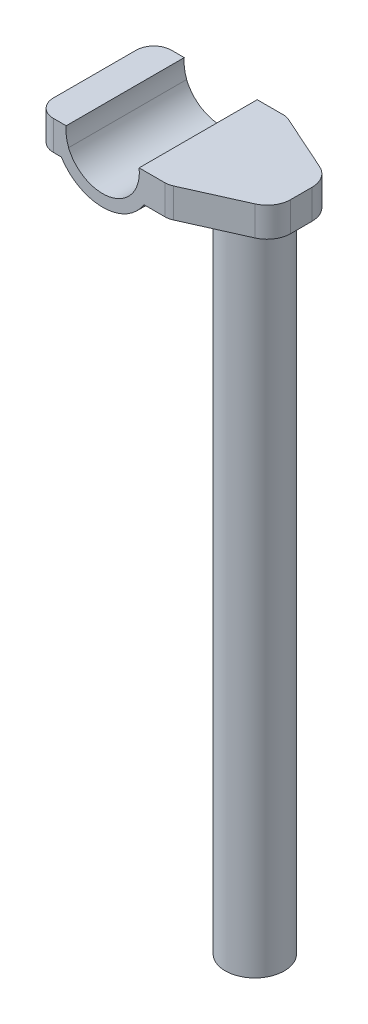
ISO-10303-21;
HEADER;
FILE_DESCRIPTION(('STEP AP214'),'2;1');
FILE_NAME('part.step','',(''),(''),'','','');
FILE_SCHEMA(('AUTOMOTIVE_DESIGN { 1 0 10303 214 1 1 1 1 }'));
ENDSEC;
DATA;
#1=APPLICATION_CONTEXT('core data for automotive mechanical design processes');
#2=APPLICATION_PROTOCOL_DEFINITION('international standard','automotive_design',2000,#1);
#3=PRODUCT_CONTEXT('',#1,'mechanical');
#4=PRODUCT('Part','Part','',(#3));
#5=PRODUCT_RELATED_PRODUCT_CATEGORY('part','',(#4));
#6=PRODUCT_DEFINITION_FORMATION('','',#4);
#7=PRODUCT_DEFINITION_CONTEXT('part definition',#1,'design');
#8=PRODUCT_DEFINITION('design','',#6,#7);
#9=PRODUCT_DEFINITION_SHAPE('','',#8);
#10=(LENGTH_UNIT() NAMED_UNIT(*) SI_UNIT(.MILLI.,.METRE.));
#11=(NAMED_UNIT(*) PLANE_ANGLE_UNIT() SI_UNIT($,.RADIAN.));
#12=(NAMED_UNIT(*) SI_UNIT($,.STERADIAN.) SOLID_ANGLE_UNIT());
#13=UNCERTAINTY_MEASURE_WITH_UNIT(LENGTH_MEASURE(1.E-05),#10,'distance_accuracy_value','');
#14=(GEOMETRIC_REPRESENTATION_CONTEXT(3) GLOBAL_UNCERTAINTY_ASSIGNED_CONTEXT((#13)) GLOBAL_UNIT_ASSIGNED_CONTEXT((#10,
#11,#12)) REPRESENTATION_CONTEXT('',''));
#15=CARTESIAN_POINT('',(0.,0.,0.));
#16=DIRECTION('',(0.,0.,1.));
#17=DIRECTION('',(1.,0.,0.));
#18=AXIS2_PLACEMENT_3D('',#15,#16,#17);
#19=CARTESIAN_POINT('',(-29.,26.,-14.));
#20=DIRECTION('',(0.,1.,0.));
#21=DIRECTION('',(0.,0.,1.));
#22=AXIS2_PLACEMENT_3D('',#19,#20,#21);
#23=PLANE('',#22);
#24=DIRECTION('',(0.,0.,1.));
#25=VECTOR('',#24,1.);
#26=CARTESIAN_POINT('',(-24.6799216430452,26.,-20.));
#27=LINE('',#26,#25);
#28=CARTESIAN_POINT('',(-24.6799216430452,26.,-20.));
#29=VERTEX_POINT('',#28);
#30=CARTESIAN_POINT('',(-24.6799216430452,26.,20.));
#31=VERTEX_POINT('',#30);
#32=EDGE_CURVE('E189',#29,#31,#27,.T.);
#33=ORIENTED_EDGE('',*,*,#32,.F.);
#34=DIRECTION('',(-1.,0.,0.));
#35=VECTOR('',#34,1.);
#36=CARTESIAN_POINT('',(8.71741430630259,26.,-20.));
#37=LINE('',#36,#35);
#38=CARTESIAN_POINT('',(-29.,26.,-20.));
#39=VERTEX_POINT('',#38);
#40=EDGE_CURVE('E225',#29,#39,#37,.T.);
#41=ORIENTED_EDGE('',*,*,#40,.T.);
#42=CARTESIAN_POINT('',(-29.,26.,-14.));
#43=DIRECTION('',(0.,1.,0.));
#44=DIRECTION('',(0.,0.,1.));
#45=AXIS2_PLACEMENT_3D('',#42,#43,#44);
#46=CIRCLE('',#45,6.);
#47=CARTESIAN_POINT('',(-35.,26.,-14.));
#48=VERTEX_POINT('',#47);
#49=EDGE_CURVE('E236',#39,#48,#46,.T.);
#50=ORIENTED_EDGE('',*,*,#49,.T.);
#51=DIRECTION('',(0.,0.,1.));
#52=VECTOR('',#51,1.);
#53=CARTESIAN_POINT('',(-35.,26.,-14.));
#54=LINE('',#53,#52);
#55=CARTESIAN_POINT('',(-35.,26.,14.));
#56=VERTEX_POINT('',#55);
#57=EDGE_CURVE('E203',#48,#56,#54,.T.);
#58=ORIENTED_EDGE('',*,*,#57,.T.);
#59=CARTESIAN_POINT('',(-29.,26.,14.));
#60=DIRECTION('',(0.,1.,0.));
#61=DIRECTION('',(0.,0.,1.));
#62=AXIS2_PLACEMENT_3D('',#59,#60,#61);
#63=CIRCLE('',#62,6.);
#64=CARTESIAN_POINT('',(-29.,26.,20.));
#65=VERTEX_POINT('',#64);
#66=EDGE_CURVE('E198',#56,#65,#63,.T.);
#67=ORIENTED_EDGE('',*,*,#66,.T.);
#68=DIRECTION('',(1.,0.,0.));
#69=VECTOR('',#68,1.);
#70=CARTESIAN_POINT('',(-29.,26.,20.));
#71=LINE('',#70,#69);
#72=EDGE_CURVE('E197',#65,#31,#71,.T.);
#73=ORIENTED_EDGE('',*,*,#72,.T.);
#74=EDGE_LOOP('',(#33,#41,#50,#58,#67,#73));
#75=FACE_BOUND('',#74,.T.);
#76=ADVANCED_FACE('F38',(#75),#23,.T.);
#77=CARTESIAN_POINT('',(-29.,20.,-14.));
#78=DIRECTION('',(0.,1.,0.));
#79=DIRECTION('',(0.,0.,1.));
#80=AXIS2_PLACEMENT_3D('',#77,#78,#79);
#81=PLANE('',#80);
#82=DIRECTION('',(-1.,0.,0.));
#83=VECTOR('',#82,1.);
#84=CARTESIAN_POINT('',(8.71741430630259,20.,-20.));
#85=LINE('',#84,#83);
#86=CARTESIAN_POINT('',(-23.8375267674244,20.,-20.));
#87=VERTEX_POINT('',#86);
#88=CARTESIAN_POINT('',(-23.9,20.,-20.));
#89=VERTEX_POINT('',#88);
#90=EDGE_CURVE('E231',#87,#89,#85,.T.);
#91=ORIENTED_EDGE('',*,*,#90,.F.);
#92=DIRECTION('',(0.,0.,1.));
#93=VECTOR('',#92,1.);
#94=CARTESIAN_POINT('',(-23.8375267674244,20.,-20.));
#95=LINE('',#94,#93);
#96=CARTESIAN_POINT('',(-23.8375267674244,20.,20.));
#97=VERTEX_POINT('',#96);
#98=EDGE_CURVE('E12',#87,#97,#95,.T.);
#99=ORIENTED_EDGE('',*,*,#98,.T.);
#100=DIRECTION('',(1.,0.,0.));
#101=VECTOR('',#100,1.);
#102=CARTESIAN_POINT('',(-29.,20.,20.));
#103=LINE('',#102,#101);
#104=CARTESIAN_POINT('',(-23.9,20.,20.));
#105=VERTEX_POINT('',#104);
#106=EDGE_CURVE('E228',#105,#97,#103,.T.);
#107=ORIENTED_EDGE('',*,*,#106,.F.);
#108=DIRECTION('',(0.,0.,1.));
#109=VECTOR('',#108,1.);
#110=CARTESIAN_POINT('',(-23.9,20.,-20.));
#111=LINE('',#110,#109);
#112=EDGE_CURVE('E256',#89,#105,#111,.T.);
#113=ORIENTED_EDGE('',*,*,#112,.F.);
#114=EDGE_LOOP('',(#91,#99,#107,#113));
#115=FACE_BOUND('',#114,.T.);
#116=ADVANCED_FACE('F339',(#115),#81,.F.);
#117=CARTESIAN_POINT('',(-29.,20.,-14.));
#118=DIRECTION('',(0.,-1.,0.));
#119=DIRECTION('',(0.,0.,-1.));
#120=AXIS2_PLACEMENT_3D('',#117,#118,#119);
#121=CYLINDRICAL_SURFACE('',#120,6.);
#122=CARTESIAN_POINT('',(-29.,16.,-14.));
#123=DIRECTION('',(0.,-1.,0.));
#124=DIRECTION('',(0.,0.,-1.));
#125=AXIS2_PLACEMENT_3D('',#122,#123,#124);
#126=CIRCLE('',#125,6.);
#127=CARTESIAN_POINT('',(-35.,16.,-14.));
#128=VERTEX_POINT('',#127);
#129=CARTESIAN_POINT('',(-29.,16.,-20.));
#130=VERTEX_POINT('',#129);
#131=EDGE_CURVE('E272',#128,#130,#126,.T.);
#132=ORIENTED_EDGE('',*,*,#131,.F.);
#133=DIRECTION('',(0.,-1.,0.));
#134=VECTOR('',#133,1.);
#135=CARTESIAN_POINT('',(-35.,20.,-14.));
#136=LINE('',#135,#134);
#137=EDGE_CURVE('E317',#48,#128,#136,.T.);
#138=ORIENTED_EDGE('',*,*,#137,.F.);
#139=ORIENTED_EDGE('',*,*,#49,.F.);
#140=DIRECTION('',(0.,-1.,0.));
#141=VECTOR('',#140,1.);
#142=CARTESIAN_POINT('',(-29.,20.,-20.));
#143=LINE('',#142,#141);
#144=EDGE_CURVE('E286',#39,#130,#143,.T.);
#145=ORIENTED_EDGE('',*,*,#144,.T.);
#146=EDGE_LOOP('',(#132,#138,#139,#145));
#147=FACE_BOUND('',#146,.T.);
#148=ADVANCED_FACE('F40',(#147),#121,.T.);
#149=CARTESIAN_POINT('',(-35.,20.,14.));
#150=DIRECTION('',(1.,0.,0.));
#151=DIRECTION('',(0.,0.,-1.));
#152=AXIS2_PLACEMENT_3D('',#149,#150,#151);
#153=PLANE('',#152);
#154=DIRECTION('',(0.,0.,1.));
#155=VECTOR('',#154,1.);
#156=CARTESIAN_POINT('',(-35.,16.,-20.));
#157=LINE('',#156,#155);
#158=CARTESIAN_POINT('',(-35.,16.,14.));
#159=VERTEX_POINT('',#158);
#160=EDGE_CURVE('E247',#128,#159,#157,.T.);
#161=ORIENTED_EDGE('',*,*,#160,.T.);
#162=DIRECTION('',(0.,-1.,0.));
#163=VECTOR('',#162,1.);
#164=CARTESIAN_POINT('',(-35.,20.,14.));
#165=LINE('',#164,#163);
#166=EDGE_CURVE('E314',#56,#159,#165,.T.);
#167=ORIENTED_EDGE('',*,*,#166,.F.);
#168=ORIENTED_EDGE('',*,*,#57,.F.);
#169=ORIENTED_EDGE('',*,*,#137,.T.);
#170=EDGE_LOOP('',(#161,#167,#168,#169));
#171=FACE_BOUND('',#170,.T.);
#172=ADVANCED_FACE('F363',(#171),#153,.F.);
#173=CARTESIAN_POINT('',(-29.,20.,14.));
#174=DIRECTION('',(0.,-1.,0.));
#175=DIRECTION('',(0.,0.,-1.));
#176=AXIS2_PLACEMENT_3D('',#173,#174,#175);
#177=CYLINDRICAL_SURFACE('',#176,6.);
#178=CARTESIAN_POINT('',(-29.,16.,14.));
#179=DIRECTION('',(0.,-1.,0.));
#180=DIRECTION('',(0.,0.,-1.));
#181=AXIS2_PLACEMENT_3D('',#178,#179,#180);
#182=CIRCLE('',#181,6.);
#183=CARTESIAN_POINT('',(-29.,16.,20.));
#184=VERTEX_POINT('',#183);
#185=EDGE_CURVE('E259',#184,#159,#182,.T.);
#186=ORIENTED_EDGE('',*,*,#185,.F.);
#187=DIRECTION('',(0.,-1.,0.));
#188=VECTOR('',#187,1.);
#189=CARTESIAN_POINT('',(-29.,20.,20.));
#190=LINE('',#189,#188);
#191=EDGE_CURVE('E311',#65,#184,#190,.T.);
#192=ORIENTED_EDGE('',*,*,#191,.F.);
#193=ORIENTED_EDGE('',*,*,#66,.F.);
#194=ORIENTED_EDGE('',*,*,#166,.T.);
#195=EDGE_LOOP('',(#186,#192,#193,#194));
#196=FACE_BOUND('',#195,.T.);
#197=ADVANCED_FACE('F358',(#196),#177,.T.);
#198=CARTESIAN_POINT('',(-29.,20.,20.));
#199=DIRECTION('',(0.,0.,-1.));
#200=DIRECTION('',(-1.,0.,0.));
#201=AXIS2_PLACEMENT_3D('',#198,#199,#200);
#202=PLANE('',#201);
#203=CARTESIAN_POINT('',(0.0273188640108665,26.,20.));
#204=VERTEX_POINT('',#203);
#205=CARTESIAN_POINT('',(8.71741430630259,26.,20.));
#206=VERTEX_POINT('',#205);
#207=EDGE_CURVE('E184',#204,#206,#71,.T.);
#208=ORIENTED_EDGE('',*,*,#207,.F.);
#209=CARTESIAN_POINT('',(-12.3263013895172,24.6753019722837,20.));
#210=DIRECTION('',(0.,0.,1.));
#211=DIRECTION('',(1.,0.,0.));
#212=AXIS2_PLACEMENT_3D('',#209,#210,#211);
#213=CIRCLE('',#212,12.4244419686767);
#214=CARTESIAN_POINT('',(-0.815076011610006,20.,20.));
#215=VERTEX_POINT('',#214);
#216=EDGE_CURVE('E172',#215,#204,#213,.T.);
#217=ORIENTED_EDGE('',*,*,#216,.F.);
#218=CARTESIAN_POINT('',(-0.775337840305649,20.,20.));
#219=VERTEX_POINT('',#218);
#220=EDGE_CURVE('E232',#215,#219,#103,.T.);
#221=ORIENTED_EDGE('',*,*,#220,.T.);
#222=CARTESIAN_POINT('',(-12.3376689201528,24.75,20.));
#223=DIRECTION('',(0.,0.,-1.));
#224=DIRECTION('',(1.,0.,0.));
#225=AXIS2_PLACEMENT_3D('',#222,#223,#224);
#226=CIRCLE('',#225,12.5);
#227=EDGE_CURVE('E240',#219,#105,#226,.T.);
#228=ORIENTED_EDGE('',*,*,#227,.T.);
#229=ORIENTED_EDGE('',*,*,#106,.T.);
#230=EDGE_CURVE('E53',#31,#97,#213,.T.);
#231=ORIENTED_EDGE('',*,*,#230,.F.);
#232=ORIENTED_EDGE('',*,*,#72,.F.);
#233=ORIENTED_EDGE('',*,*,#191,.T.);
#234=DIRECTION('',(1.,0.,0.));
#235=VECTOR('',#234,1.);
#236=CARTESIAN_POINT('',(-35.,16.,20.));
#237=LINE('',#236,#235);
#238=CARTESIAN_POINT('',(-26.3265037536906,16.,20.));
#239=VERTEX_POINT('',#238);
#240=EDGE_CURVE('E227',#184,#239,#237,.T.);
#241=ORIENTED_EDGE('',*,*,#240,.T.);
#242=CARTESIAN_POINT('',(-12.3376689201528,24.75,20.));
#243=DIRECTION('',(0.,0.,1.));
#244=DIRECTION('',(1.,0.,0.));
#245=AXIS2_PLACEMENT_3D('',#242,#243,#244);
#246=CIRCLE('',#245,16.5);
#247=CARTESIAN_POINT('',(1.65116591338496,16.,20.));
#248=VERTEX_POINT('',#247);
#249=EDGE_CURVE('E250',#239,#248,#246,.T.);
#250=ORIENTED_EDGE('',*,*,#249,.T.);
#251=DIRECTION('',(1.,0.,0.));
#252=VECTOR('',#251,1.);
#253=CARTESIAN_POINT('',(1.65116591338496,16.,20.));
#254=LINE('',#253,#252);
#255=CARTESIAN_POINT('',(8.71741430630261,16.,20.));
#256=VERTEX_POINT('',#255);
#257=EDGE_CURVE('E253',#248,#256,#254,.T.);
#258=ORIENTED_EDGE('',*,*,#257,.T.);
#259=DIRECTION('',(0.,-1.,0.));
#260=VECTOR('',#259,1.);
#261=CARTESIAN_POINT('',(8.71741430630259,20.,20.));
#262=LINE('',#261,#260);
#263=EDGE_CURVE('E195',#206,#256,#262,.T.);
#264=ORIENTED_EDGE('',*,*,#263,.F.);
#265=EDGE_LOOP('',(#208,#217,#221,#228,#229,#231,#232,#233,#241,#250,#258,#264));
#266=FACE_BOUND('',#265,.T.);
#267=ADVANCED_FACE('F192',(#266),#202,.F.);
#268=CARTESIAN_POINT('',(8.71741430630261,20.,14.));
#269=DIRECTION('',(0.,-1.,0.));
#270=DIRECTION('',(0.,0.,-1.));
#271=AXIS2_PLACEMENT_3D('',#268,#269,#270);
#272=CYLINDRICAL_SURFACE('',#271,6.);
#273=CARTESIAN_POINT('',(8.71741430630261,16.,14.));
#274=DIRECTION('',(0.,-1.,0.));
#275=DIRECTION('',(0.,0.,-1.));
#276=AXIS2_PLACEMENT_3D('',#273,#274,#275);
#277=CIRCLE('',#276,6.);
#278=CARTESIAN_POINT('',(11.1704919000042,16.,19.4756196287981));
#279=VERTEX_POINT('',#278);
#280=EDGE_CURVE('E284',#279,#256,#277,.T.);
#281=ORIENTED_EDGE('',*,*,#280,.F.);
#282=DIRECTION('',(0.,-1.,0.));
#283=VECTOR('',#282,1.);
#284=CARTESIAN_POINT('',(11.1704919000042,20.,19.4756196287981));
#285=LINE('',#284,#283);
#286=CARTESIAN_POINT('',(11.1704919000042,26.,19.4756196287981));
#287=VERTEX_POINT('',#286);
#288=EDGE_CURVE('E307',#287,#279,#285,.T.);
#289=ORIENTED_EDGE('',*,*,#288,.F.);
#290=CARTESIAN_POINT('',(8.71741430630261,26.,14.));
#291=DIRECTION('',(0.,1.,0.));
#292=DIRECTION('',(0.,0.,1.));
#293=AXIS2_PLACEMENT_3D('',#290,#291,#292);
#294=CIRCLE('',#293,6.);
#295=EDGE_CURVE('E201',#206,#287,#294,.T.);
#296=ORIENTED_EDGE('',*,*,#295,.F.);
#297=ORIENTED_EDGE('',*,*,#263,.T.);
#298=EDGE_LOOP('',(#281,#289,#296,#297));
#299=FACE_BOUND('',#298,.T.);
#300=ADVANCED_FACE('F374',(#299),#272,.T.);
#301=CARTESIAN_POINT('',(11.1704919000042,20.,19.4756196287981));
#302=DIRECTION('',(-0.408846265616927,0.,-0.912603271466355));
#303=DIRECTION('',(-0.912603271466355,0.,0.408846265616927));
#304=AXIS2_PLACEMENT_3D('',#301,#302,#303);
#305=PLANE('',#304);
#306=DIRECTION('',(-0.912603271466355,0.,0.408846265616927));
#307=VECTOR('',#306,1.);
#308=CARTESIAN_POINT('',(11.1704919000042,16.,19.4756196287981));
#309=LINE('',#308,#307);
#310=CARTESIAN_POINT('',(30.2707701249354,16.,10.9186949840289));
#311=VERTEX_POINT('',#310);
#312=EDGE_CURVE('E282',#311,#279,#309,.T.);
#313=ORIENTED_EDGE('',*,*,#312,.F.);
#314=DIRECTION('',(0.,-1.,0.));
#315=VECTOR('',#314,1.);
#316=CARTESIAN_POINT('',(30.2707701249354,20.,10.9186949840289));
#317=LINE('',#316,#315);
#318=CARTESIAN_POINT('',(30.2707701249354,26.,10.9186949840289));
#319=VERTEX_POINT('',#318);
#320=EDGE_CURVE('E304',#319,#311,#317,.T.);
#321=ORIENTED_EDGE('',*,*,#320,.F.);
#322=DIRECTION('',(0.912603271466355,0.,-0.408846265616927));
#323=VECTOR('',#322,1.);
#324=CARTESIAN_POINT('',(11.1704919000042,26.,19.4756196287981));
#325=LINE('',#324,#323);
#326=EDGE_CURVE('E208',#287,#319,#325,.T.);
#327=ORIENTED_EDGE('',*,*,#326,.F.);
#328=ORIENTED_EDGE('',*,*,#288,.T.);
#329=EDGE_LOOP('',(#313,#321,#327,#328));
#330=FACE_BOUND('',#329,.T.);
#331=ADVANCED_FACE('F379',(#330),#305,.F.);
#332=CARTESIAN_POINT('',(27.,20.,3.6178688122981));
#333=DIRECTION('',(0.,-1.,0.));
#334=DIRECTION('',(0.,0.,-1.));
#335=AXIS2_PLACEMENT_3D('',#332,#333,#334);
#336=CYLINDRICAL_SURFACE('',#335,8.);
#337=CARTESIAN_POINT('',(27.,16.,3.6178688122981));
#338=DIRECTION('',(0.,-1.,0.));
#339=DIRECTION('',(0.,0.,-1.));
#340=AXIS2_PLACEMENT_3D('',#337,#338,#339);
#341=CIRCLE('',#340,8.);
#342=CARTESIAN_POINT('',(35.,16.,3.61786881229806));
#343=VERTEX_POINT('',#342);
#344=EDGE_CURVE('E280',#343,#311,#341,.T.);
#345=ORIENTED_EDGE('',*,*,#344,.F.);
#346=DIRECTION('',(0.,-1.,0.));
#347=VECTOR('',#346,1.);
#348=CARTESIAN_POINT('',(35.,20.,3.61786881229806));
#349=LINE('',#348,#347);
#350=CARTESIAN_POINT('',(35.,26.,3.6178688122981));
#351=VERTEX_POINT('',#350);
#352=EDGE_CURVE('E301',#351,#343,#349,.T.);
#353=ORIENTED_EDGE('',*,*,#352,.F.);
#354=CARTESIAN_POINT('',(27.,26.,3.6178688122981));
#355=DIRECTION('',(0.,1.,0.));
#356=DIRECTION('',(0.,0.,1.));
#357=AXIS2_PLACEMENT_3D('',#354,#355,#356);
#358=CIRCLE('',#357,8.);
#359=EDGE_CURVE('E211',#319,#351,#358,.T.);
#360=ORIENTED_EDGE('',*,*,#359,.F.);
#361=ORIENTED_EDGE('',*,*,#320,.T.);
#362=EDGE_LOOP('',(#345,#353,#360,#361));
#363=FACE_BOUND('',#362,.T.);
#364=ADVANCED_FACE('F382',(#363),#336,.T.);
#365=CARTESIAN_POINT('',(35.,20.,-3.61786881229806));
#366=DIRECTION('',(-1.,0.,0.));
#367=DIRECTION('',(0.,0.,1.));
#368=AXIS2_PLACEMENT_3D('',#365,#366,#367);
#369=PLANE('',#368);
#370=DIRECTION('',(0.,0.,1.));
#371=VECTOR('',#370,1.);
#372=CARTESIAN_POINT('',(35.,16.,-20.));
#373=LINE('',#372,#371);
#374=CARTESIAN_POINT('',(35.,16.,-3.6178688122981));
#375=VERTEX_POINT('',#374);
#376=EDGE_CURVE('E263',#375,#343,#373,.T.);
#377=ORIENTED_EDGE('',*,*,#376,.F.);
#378=DIRECTION('',(0.,-1.,0.));
#379=VECTOR('',#378,1.);
#380=CARTESIAN_POINT('',(35.,20.,-3.61786881229806));
#381=LINE('',#380,#379);
#382=CARTESIAN_POINT('',(35.,26.,-3.61786881229806));
#383=VERTEX_POINT('',#382);
#384=EDGE_CURVE('E298',#383,#375,#381,.T.);
#385=ORIENTED_EDGE('',*,*,#384,.F.);
#386=DIRECTION('',(0.,0.,-1.));
#387=VECTOR('',#386,1.);
#388=CARTESIAN_POINT('',(35.,26.,3.6178688122981));
#389=LINE('',#388,#387);
#390=EDGE_CURVE('E214',#351,#383,#389,.T.);
#391=ORIENTED_EDGE('',*,*,#390,.F.);
#392=ORIENTED_EDGE('',*,*,#352,.T.);
#393=EDGE_LOOP('',(#377,#385,#391,#392));
#394=FACE_BOUND('',#393,.T.);
#395=ADVANCED_FACE('F387',(#394),#369,.F.);
#396=CARTESIAN_POINT('',(27.,20.,-3.6178688122981));
#397=DIRECTION('',(0.,-1.,0.));
#398=DIRECTION('',(0.,0.,-1.));
#399=AXIS2_PLACEMENT_3D('',#396,#397,#398);
#400=CYLINDRICAL_SURFACE('',#399,8.);
#401=CARTESIAN_POINT('',(27.,16.,-3.6178688122981));
#402=DIRECTION('',(0.,-1.,0.));
#403=DIRECTION('',(0.,0.,-1.));
#404=AXIS2_PLACEMENT_3D('',#401,#402,#403);
#405=CIRCLE('',#404,8.);
#406=CARTESIAN_POINT('',(30.2707701249354,16.,-10.9186949840289));
#407=VERTEX_POINT('',#406);
#408=EDGE_CURVE('E278',#407,#375,#405,.T.);
#409=ORIENTED_EDGE('',*,*,#408,.F.);
#410=DIRECTION('',(0.,-1.,0.));
#411=VECTOR('',#410,1.);
#412=CARTESIAN_POINT('',(30.2707701249354,20.,-10.9186949840289));
#413=LINE('',#412,#411);
#414=CARTESIAN_POINT('',(30.2707701249354,26.,-10.9186949840289));
#415=VERTEX_POINT('',#414);
#416=EDGE_CURVE('E295',#415,#407,#413,.T.);
#417=ORIENTED_EDGE('',*,*,#416,.F.);
#418=CARTESIAN_POINT('',(27.,26.,-3.6178688122981));
#419=DIRECTION('',(0.,1.,0.));
#420=DIRECTION('',(0.,0.,1.));
#421=AXIS2_PLACEMENT_3D('',#418,#419,#420);
#422=CIRCLE('',#421,8.);
#423=EDGE_CURVE('E217',#383,#415,#422,.T.);
#424=ORIENTED_EDGE('',*,*,#423,.F.);
#425=ORIENTED_EDGE('',*,*,#384,.T.);
#426=EDGE_LOOP('',(#409,#417,#424,#425));
#427=FACE_BOUND('',#426,.T.);
#428=ADVANCED_FACE('F390',(#427),#400,.T.);
#429=CARTESIAN_POINT('',(11.1704919000042,20.,-19.4756196287981));
#430=DIRECTION('',(-0.408846265616927,0.,0.912603271466355));
#431=DIRECTION('',(0.912603271466355,0.,0.408846265616927));
#432=AXIS2_PLACEMENT_3D('',#429,#430,#431);
#433=PLANE('',#432);
#434=DIRECTION('',(0.912603271466355,0.,0.408846265616927));
#435=VECTOR('',#434,1.);
#436=CARTESIAN_POINT('',(11.1704919000042,16.,-19.4756196287981));
#437=LINE('',#436,#435);
#438=CARTESIAN_POINT('',(11.1704919000042,16.,-19.4756196287981));
#439=VERTEX_POINT('',#438);
#440=EDGE_CURVE('E276',#439,#407,#437,.T.);
#441=ORIENTED_EDGE('',*,*,#440,.F.);
#442=DIRECTION('',(0.,-1.,0.));
#443=VECTOR('',#442,1.);
#444=CARTESIAN_POINT('',(11.1704919000042,20.,-19.4756196287981));
#445=LINE('',#444,#443);
#446=CARTESIAN_POINT('',(11.1704919000042,26.,-19.4756196287981));
#447=VERTEX_POINT('',#446);
#448=EDGE_CURVE('E292',#447,#439,#445,.T.);
#449=ORIENTED_EDGE('',*,*,#448,.F.);
#450=DIRECTION('',(-0.912603271466355,0.,-0.408846265616927));
#451=VECTOR('',#450,1.);
#452=CARTESIAN_POINT('',(30.2707701249354,26.,-10.9186949840289));
#453=LINE('',#452,#451);
#454=EDGE_CURVE('E220',#415,#447,#453,.T.);
#455=ORIENTED_EDGE('',*,*,#454,.F.);
#456=ORIENTED_EDGE('',*,*,#416,.T.);
#457=EDGE_LOOP('',(#441,#449,#455,#456));
#458=FACE_BOUND('',#457,.T.);
#459=ADVANCED_FACE('F395',(#458),#433,.F.);
#460=CARTESIAN_POINT('',(8.71741430630261,20.,-14.));
#461=DIRECTION('',(0.,-1.,0.));
#462=DIRECTION('',(0.,0.,-1.));
#463=AXIS2_PLACEMENT_3D('',#460,#461,#462);
#464=CYLINDRICAL_SURFACE('',#463,6.);
#465=CARTESIAN_POINT('',(8.71741430630261,16.,-14.));
#466=DIRECTION('',(0.,-1.,0.));
#467=DIRECTION('',(0.,0.,-1.));
#468=AXIS2_PLACEMENT_3D('',#465,#466,#467);
#469=CIRCLE('',#468,6.);
#470=CARTESIAN_POINT('',(8.71741430630259,16.,-20.));
#471=VERTEX_POINT('',#470);
#472=EDGE_CURVE('E274',#471,#439,#469,.T.);
#473=ORIENTED_EDGE('',*,*,#472,.F.);
#474=DIRECTION('',(0.,-1.,0.));
#475=VECTOR('',#474,1.);
#476=CARTESIAN_POINT('',(8.71741430630259,20.,-20.));
#477=LINE('',#476,#475);
#478=CARTESIAN_POINT('',(8.71741430630259,26.,-20.));
#479=VERTEX_POINT('',#478);
#480=EDGE_CURVE('E289',#479,#471,#477,.T.);
#481=ORIENTED_EDGE('',*,*,#480,.F.);
#482=CARTESIAN_POINT('',(8.71741430630261,26.,-14.));
#483=DIRECTION('',(0.,1.,0.));
#484=DIRECTION('',(0.,0.,1.));
#485=AXIS2_PLACEMENT_3D('',#482,#483,#484);
#486=CIRCLE('',#485,6.);
#487=EDGE_CURVE('E223',#447,#479,#486,.T.);
#488=ORIENTED_EDGE('',*,*,#487,.F.);
#489=ORIENTED_EDGE('',*,*,#448,.T.);
#490=EDGE_LOOP('',(#473,#481,#488,#489));
#491=FACE_BOUND('',#490,.T.);
#492=ADVANCED_FACE('F398',(#491),#464,.T.);
#493=CARTESIAN_POINT('',(-29.,20.,-20.));
#494=DIRECTION('',(0.,0.,1.));
#495=DIRECTION('',(1.,0.,0.));
#496=AXIS2_PLACEMENT_3D('',#493,#494,#495);
#497=PLANE('',#496);
#498=ORIENTED_EDGE('',*,*,#40,.F.);
#499=CARTESIAN_POINT('',(-12.3263013895172,24.6753019722837,-20.));
#500=DIRECTION('',(0.,0.,1.));
#501=DIRECTION('',(1.,0.,0.));
#502=AXIS2_PLACEMENT_3D('',#499,#500,#501);
#503=CIRCLE('',#502,12.4244419686767);
#504=EDGE_CURVE('E190',#29,#87,#503,.T.);
#505=ORIENTED_EDGE('',*,*,#504,.T.);
#506=ORIENTED_EDGE('',*,*,#90,.T.);
#507=CARTESIAN_POINT('',(-12.3376689201528,24.75,-20.));
#508=DIRECTION('',(0.,0.,-1.));
#509=DIRECTION('',(1.,0.,0.));
#510=AXIS2_PLACEMENT_3D('',#507,#508,#509);
#511=CIRCLE('',#510,12.5);
#512=CARTESIAN_POINT('',(-0.775337840305651,20.,-20.));
#513=VERTEX_POINT('',#512);
#514=EDGE_CURVE('E245',#513,#89,#511,.T.);
#515=ORIENTED_EDGE('',*,*,#514,.F.);
#516=CARTESIAN_POINT('',(-0.815076011610006,20.,-20.));
#517=VERTEX_POINT('',#516);
#518=EDGE_CURVE('E233',#513,#517,#85,.T.);
#519=ORIENTED_EDGE('',*,*,#518,.T.);
#520=CARTESIAN_POINT('',(0.0273188640108665,26.,-20.));
#521=VERTEX_POINT('',#520);
#522=EDGE_CURVE('E60',#517,#521,#503,.T.);
#523=ORIENTED_EDGE('',*,*,#522,.T.);
#524=EDGE_CURVE('E188',#479,#521,#37,.T.);
#525=ORIENTED_EDGE('',*,*,#524,.F.);
#526=ORIENTED_EDGE('',*,*,#480,.T.);
#527=DIRECTION('',(1.,0.,0.));
#528=VECTOR('',#527,1.);
#529=CARTESIAN_POINT('',(1.65116591338496,16.,-20.));
#530=LINE('',#529,#528);
#531=CARTESIAN_POINT('',(1.65116591338496,16.,-20.));
#532=VERTEX_POINT('',#531);
#533=EDGE_CURVE('E243',#532,#471,#530,.T.);
#534=ORIENTED_EDGE('',*,*,#533,.F.);
#535=CARTESIAN_POINT('',(-12.3376689201528,24.75,-20.));
#536=DIRECTION('',(0.,0.,1.));
#537=DIRECTION('',(1.,0.,0.));
#538=AXIS2_PLACEMENT_3D('',#535,#536,#537);
#539=CIRCLE('',#538,16.5);
#540=CARTESIAN_POINT('',(-26.3265037536906,16.,-20.));
#541=VERTEX_POINT('',#540);
#542=EDGE_CURVE('E239',#541,#532,#539,.T.);
#543=ORIENTED_EDGE('',*,*,#542,.F.);
#544=DIRECTION('',(1.,0.,0.));
#545=VECTOR('',#544,1.);
#546=CARTESIAN_POINT('',(-35.,16.,-20.));
#547=LINE('',#546,#545);
#548=EDGE_CURVE('E237',#130,#541,#547,.T.);
#549=ORIENTED_EDGE('',*,*,#548,.F.);
#550=ORIENTED_EDGE('',*,*,#144,.F.);
#551=EDGE_LOOP('',(#498,#505,#506,#515,#519,#523,#525,#526,#534,#543,#549,#550));
#552=FACE_BOUND('',#551,.T.);
#553=ADVANCED_FACE('F329',(#552),#497,.F.);
#554=CARTESIAN_POINT('',(-12.3376689201528,24.75,-20.));
#555=DIRECTION('',(0.,0.,1.));
#556=DIRECTION('',(1.,0.,0.));
#557=AXIS2_PLACEMENT_3D('',#554,#555,#556);
#558=CYLINDRICAL_SURFACE('',#557,12.5);
#559=ORIENTED_EDGE('',*,*,#112,.T.);
#560=ORIENTED_EDGE('',*,*,#227,.F.);
#561=DIRECTION('',(0.,0.,1.));
#562=VECTOR('',#561,1.);
#563=CARTESIAN_POINT('',(-0.775337840305651,20.,-20.));
#564=LINE('',#563,#562);
#565=EDGE_CURVE('E260',#513,#219,#564,.T.);
#566=ORIENTED_EDGE('',*,*,#565,.F.);
#567=ORIENTED_EDGE('',*,*,#514,.T.);
#568=EDGE_LOOP('',(#559,#560,#566,#567));
#569=FACE_BOUND('',#568,.T.);
#570=ADVANCED_FACE('F335',(#569),#558,.F.);
#571=CARTESIAN_POINT('',(1.65116591338496,16.,-20.));
#572=DIRECTION('',(0.,-1.,0.));
#573=DIRECTION('',(0.,0.,-1.));
#574=AXIS2_PLACEMENT_3D('',#571,#572,#573);
#575=PLANE('',#574);
#576=CARTESIAN_POINT('',(19.2246621596943,16.,0.));
#577=DIRECTION('',(0.,-1.,0.));
#578=DIRECTION('',(0.,0.,-1.));
#579=AXIS2_PLACEMENT_3D('',#576,#577,#578);
#580=CIRCLE('',#579,10.);
#581=CARTESIAN_POINT('',(19.2246621596943,16.,-10.));
#582=VERTEX_POINT('',#581);
#583=EDGE_CURVE('E320',#582,#582,#580,.F.);
#584=ORIENTED_EDGE('',*,*,#583,.T.);
#585=EDGE_LOOP('',(#584));
#586=FACE_BOUND('',#585,.T.);
#587=ORIENTED_EDGE('',*,*,#280,.T.);
#588=ORIENTED_EDGE('',*,*,#257,.F.);
#589=DIRECTION('',(0.,0.,1.));
#590=VECTOR('',#589,1.);
#591=CARTESIAN_POINT('',(1.65116591338496,16.,-20.));
#592=LINE('',#591,#590);
#593=EDGE_CURVE('E265',#532,#248,#592,.T.);
#594=ORIENTED_EDGE('',*,*,#593,.F.);
#595=ORIENTED_EDGE('',*,*,#533,.T.);
#596=ORIENTED_EDGE('',*,*,#472,.T.);
#597=ORIENTED_EDGE('',*,*,#440,.T.);
#598=ORIENTED_EDGE('',*,*,#408,.T.);
#599=ORIENTED_EDGE('',*,*,#376,.T.);
#600=ORIENTED_EDGE('',*,*,#344,.T.);
#601=ORIENTED_EDGE('',*,*,#312,.T.);
#602=EDGE_LOOP('',(#587,#588,#594,#595,#596,#597,#598,#599,#600,#601));
#603=FACE_BOUND('',#602,.T.);
#604=ADVANCED_FACE('F400',(#586,#603),#575,.T.);
#605=CARTESIAN_POINT('',(-35.,16.,-20.));
#606=DIRECTION('',(0.,-1.,0.));
#607=DIRECTION('',(0.,0.,-1.));
#608=AXIS2_PLACEMENT_3D('',#605,#606,#607);
#609=PLANE('',#608);
#610=ORIENTED_EDGE('',*,*,#131,.T.);
#611=ORIENTED_EDGE('',*,*,#548,.T.);
#612=DIRECTION('',(0.,0.,1.));
#613=VECTOR('',#612,1.);
#614=CARTESIAN_POINT('',(-26.3265037536906,16.,-20.));
#615=LINE('',#614,#613);
#616=EDGE_CURVE('E267',#541,#239,#615,.T.);
#617=ORIENTED_EDGE('',*,*,#616,.T.);
#618=ORIENTED_EDGE('',*,*,#240,.F.);
#619=ORIENTED_EDGE('',*,*,#185,.T.);
#620=ORIENTED_EDGE('',*,*,#160,.F.);
#621=EDGE_LOOP('',(#610,#611,#617,#618,#619,#620));
#622=FACE_BOUND('',#621,.T.);
#623=ADVANCED_FACE('F365',(#622),#609,.T.);
#624=CARTESIAN_POINT('',(-12.3376689201528,24.75,-20.));
#625=DIRECTION('',(0.,0.,1.));
#626=DIRECTION('',(1.,0.,0.));
#627=AXIS2_PLACEMENT_3D('',#624,#625,#626);
#628=CYLINDRICAL_SURFACE('',#627,16.5);
#629=ORIENTED_EDGE('',*,*,#249,.F.);
#630=ORIENTED_EDGE('',*,*,#616,.F.);
#631=ORIENTED_EDGE('',*,*,#542,.T.);
#632=ORIENTED_EDGE('',*,*,#593,.T.);
#633=EDGE_LOOP('',(#629,#630,#631,#632));
#634=FACE_BOUND('',#633,.T.);
#635=ADVANCED_FACE('F369',(#634),#628,.T.);
#636=DIRECTION('',(0.,0.,1.));
#637=VECTOR('',#636,1.);
#638=CARTESIAN_POINT('',(0.0273188640108665,26.,-20.));
#639=LINE('',#638,#637);
#640=EDGE_CURVE('E175',#204,#521,#639,.F.);
#641=ORIENTED_EDGE('',*,*,#640,.F.);
#642=ORIENTED_EDGE('',*,*,#207,.T.);
#643=ORIENTED_EDGE('',*,*,#295,.T.);
#644=ORIENTED_EDGE('',*,*,#326,.T.);
#645=ORIENTED_EDGE('',*,*,#359,.T.);
#646=ORIENTED_EDGE('',*,*,#390,.T.);
#647=ORIENTED_EDGE('',*,*,#423,.T.);
#648=ORIENTED_EDGE('',*,*,#454,.T.);
#649=ORIENTED_EDGE('',*,*,#487,.T.);
#650=ORIENTED_EDGE('',*,*,#524,.T.);
#651=EDGE_LOOP('',(#641,#642,#643,#644,#645,#646,#647,#648,#649,#650));
#652=FACE_BOUND('',#651,.T.);
#653=ADVANCED_FACE('F182',(#652),#23,.T.);
#654=ORIENTED_EDGE('',*,*,#220,.F.);
#655=DIRECTION('',(0.,0.,1.));
#656=VECTOR('',#655,1.);
#657=CARTESIAN_POINT('',(-0.815076011610006,20.,-20.));
#658=LINE('',#657,#656);
#659=EDGE_CURVE('E46',#215,#517,#658,.F.);
#660=ORIENTED_EDGE('',*,*,#659,.T.);
#661=ORIENTED_EDGE('',*,*,#518,.F.);
#662=ORIENTED_EDGE('',*,*,#565,.T.);
#663=EDGE_LOOP('',(#654,#660,#661,#662));
#664=FACE_BOUND('',#663,.T.);
#665=ADVANCED_FACE('F325',(#664),#81,.F.);
#666=CARTESIAN_POINT('',(19.2246621596943,-205.,0.));
#667=DIRECTION('',(0.,1.,0.));
#668=DIRECTION('',(0.,0.,1.));
#669=AXIS2_PLACEMENT_3D('',#666,#667,#668);
#670=CYLINDRICAL_SURFACE('',#669,10.);
#671=ORIENTED_EDGE('',*,*,#583,.F.);
#672=EDGE_LOOP('',(#671));
#673=FACE_BOUND('',#672,.T.);
#674=CARTESIAN_POINT('',(19.2246621596943,-205.,0.));
#675=DIRECTION('',(0.,-1.,0.));
#676=DIRECTION('',(0.,0.,-1.));
#677=AXIS2_PLACEMENT_3D('',#674,#675,#676);
#678=CIRCLE('',#677,10.);
#679=CARTESIAN_POINT('',(19.2246621596943,-205.,-10.));
#680=VERTEX_POINT('',#679);
#681=EDGE_CURVE('E322',#680,#680,#678,.T.);
#682=ORIENTED_EDGE('',*,*,#681,.F.);
#683=EDGE_LOOP('',(#682));
#684=FACE_BOUND('',#683,.T.);
#685=ADVANCED_FACE('F423',(#673,#684),#670,.T.);
#686=CARTESIAN_POINT('',(19.2246621596943,-205.,0.));
#687=DIRECTION('',(0.,-1.,0.));
#688=DIRECTION('',(0.,0.,-1.));
#689=AXIS2_PLACEMENT_3D('',#686,#687,#688);
#690=PLANE('',#689);
#691=ORIENTED_EDGE('',*,*,#681,.T.);
#692=EDGE_LOOP('',(#691));
#693=FACE_BOUND('',#692,.T.);
#694=ADVANCED_FACE('F504',(#693),#690,.T.);
#695=CARTESIAN_POINT('',(-12.3263013895172,24.6753019722837,-20.));
#696=DIRECTION('',(0.,0.,1.));
#697=DIRECTION('',(1.,0.,0.));
#698=AXIS2_PLACEMENT_3D('',#695,#696,#697);
#699=CYLINDRICAL_SURFACE('',#698,12.4244419686767);
#700=ORIENTED_EDGE('',*,*,#640,.T.);
#701=ORIENTED_EDGE('',*,*,#522,.F.);
#702=ORIENTED_EDGE('',*,*,#659,.F.);
#703=ORIENTED_EDGE('',*,*,#216,.T.);
#704=EDGE_LOOP('',(#700,#701,#702,#703));
#705=FACE_BOUND('',#704,.T.);
#706=ADVANCED_FACE('F174',(#705),#699,.F.);
#707=ORIENTED_EDGE('',*,*,#32,.T.);
#708=ORIENTED_EDGE('',*,*,#230,.T.);
#709=ORIENTED_EDGE('',*,*,#98,.F.);
#710=ORIENTED_EDGE('',*,*,#504,.F.);
#711=EDGE_LOOP('',(#707,#708,#709,#710));
#712=FACE_BOUND('',#711,.T.);
#713=ADVANCED_FACE('F340',(#712),#699,.F.);
#714=CLOSED_SHELL('',(#76,#116,#148,#172,#197,#267,#300,#331,#364,#395,#428,#459,#492,#553,#570,
#604,#623,#635,#653,#665,#685,#694,#706,#713));
#715=MANIFOLD_SOLID_BREP('B2',#714);
#716=ADVANCED_BREP_SHAPE_REPRESENTATION('',(#18,#715),#14);
#717=SHAPE_DEFINITION_REPRESENTATION(#9,#716);
ENDSEC;
END-ISO-10303-21;
